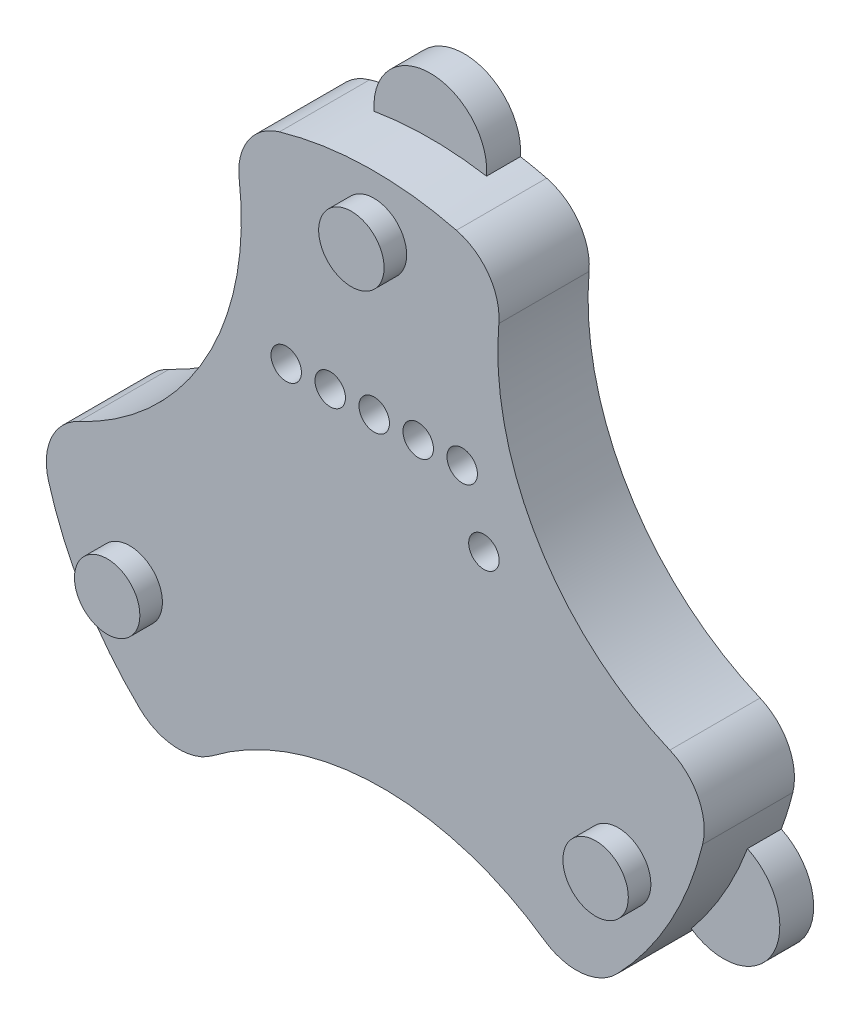
ISO-10303-21;
HEADER;
FILE_DESCRIPTION(('STEP AP214'),'2;1');
FILE_NAME('part.step','',(''),(''),'','','');
FILE_SCHEMA(('AUTOMOTIVE_DESIGN { 1 0 10303 214 1 1 1 1 }'));
ENDSEC;
DATA;
#1=APPLICATION_CONTEXT('core data for automotive mechanical design processes');
#2=APPLICATION_PROTOCOL_DEFINITION('international standard','automotive_design',2000,#1);
#3=PRODUCT_CONTEXT('',#1,'mechanical');
#4=PRODUCT('Part','Part','',(#3));
#5=PRODUCT_RELATED_PRODUCT_CATEGORY('part','',(#4));
#6=PRODUCT_DEFINITION_FORMATION('','',#4);
#7=PRODUCT_DEFINITION_CONTEXT('part definition',#1,'design');
#8=PRODUCT_DEFINITION('design','',#6,#7);
#9=PRODUCT_DEFINITION_SHAPE('','',#8);
#10=(LENGTH_UNIT() NAMED_UNIT(*) SI_UNIT(.MILLI.,.METRE.));
#11=(NAMED_UNIT(*) PLANE_ANGLE_UNIT() SI_UNIT($,.RADIAN.));
#12=(NAMED_UNIT(*) SI_UNIT($,.STERADIAN.) SOLID_ANGLE_UNIT());
#13=UNCERTAINTY_MEASURE_WITH_UNIT(LENGTH_MEASURE(1.E-05),#10,'distance_accuracy_value','');
#14=(GEOMETRIC_REPRESENTATION_CONTEXT(3) GLOBAL_UNCERTAINTY_ASSIGNED_CONTEXT((#13)) GLOBAL_UNIT_ASSIGNED_CONTEXT((#10,
#11,#12)) REPRESENTATION_CONTEXT('',''));
#15=CARTESIAN_POINT('',(0.,0.,0.));
#16=DIRECTION('',(0.,0.,1.));
#17=DIRECTION('',(1.,0.,0.));
#18=AXIS2_PLACEMENT_3D('',#15,#16,#17);
#19=CARTESIAN_POINT('',(0.,0.,-74.8528137423857));
#20=DIRECTION('',(0.,0.,1.));
#21=DIRECTION('',(1.,0.,0.));
#22=AXIS2_PLACEMENT_3D('',#19,#20,#21);
#23=CYLINDRICAL_SURFACE('',#22,30.);
#24=CARTESIAN_POINT('',(0.,0.,18.));
#25=DIRECTION('',(0.,0.,1.));
#26=DIRECTION('',(1.,0.,0.));
#27=AXIS2_PLACEMENT_3D('',#24,#25,#26);
#28=CIRCLE('',#27,30.);
#29=CARTESIAN_POINT('',(21.5430409730913,-20.8781557047481,18.));
#30=VERTEX_POINT('',#29);
#31=CARTESIAN_POINT('',(29.1356396654635,-7.14944062736878,18.));
#32=VERTEX_POINT('',#31);
#33=EDGE_CURVE('E308',#30,#32,#28,.T.);
#34=ORIENTED_EDGE('',*,*,#33,.F.);
#35=DIRECTION('',(0.,0.,1.));
#36=VECTOR('',#35,1.);
#37=CARTESIAN_POINT('',(21.5430409730913,-20.8781557047482,-74.8528137423857));
#38=LINE('',#37,#36);
#39=CARTESIAN_POINT('',(21.5430409730913,-20.8781557047481,9.99999999999999));
#40=VERTEX_POINT('',#39);
#41=EDGE_CURVE('E238',#30,#40,#38,.F.);
#42=ORIENTED_EDGE('',*,*,#41,.T.);
#43=CARTESIAN_POINT('',(0.,0.,9.99999999999999));
#44=DIRECTION('',(0.,0.,1.));
#45=DIRECTION('',(1.,0.,0.));
#46=AXIS2_PLACEMENT_3D('',#43,#44,#45);
#47=CIRCLE('',#46,30.);
#48=CARTESIAN_POINT('',(23.1286138738096,-19.1067323285857,9.99999999999999));
#49=VERTEX_POINT('',#48);
#50=EDGE_CURVE('E174',#49,#40,#47,.F.);
#51=ORIENTED_EDGE('',*,*,#50,.F.);
#52=DIRECTION('',(0.,0.,-1.));
#53=VECTOR('',#52,1.);
#54=CARTESIAN_POINT('',(23.1286138738096,-19.1067323285857,11.5));
#55=LINE('',#54,#53);
#56=CARTESIAN_POINT('',(23.1286138738096,-19.1067323285857,13.));
#57=VERTEX_POINT('',#56);
#58=EDGE_CURVE('E183',#57,#49,#55,.T.);
#59=ORIENTED_EDGE('',*,*,#58,.F.);
#60=CARTESIAN_POINT('',(0.,0.,13.));
#61=DIRECTION('',(0.,0.,-1.));
#62=DIRECTION('',(-1.,0.,0.));
#63=AXIS2_PLACEMENT_3D('',#60,#61,#62);
#64=CIRCLE('',#63,30.);
#65=CARTESIAN_POINT('',(28.1112225167689,-10.4766010047489,13.));
#66=VERTEX_POINT('',#65);
#67=EDGE_CURVE('E190',#57,#66,#64,.F.);
#68=ORIENTED_EDGE('',*,*,#67,.T.);
#69=DIRECTION('',(0.,0.,-1.));
#70=VECTOR('',#69,1.);
#71=CARTESIAN_POINT('',(28.1112225167689,-10.4766010047489,11.5));
#72=LINE('',#71,#70);
#73=CARTESIAN_POINT('',(28.1112225167689,-10.4766010047489,10.));
#74=VERTEX_POINT('',#73);
#75=EDGE_CURVE('E180',#74,#66,#72,.F.);
#76=ORIENTED_EDGE('',*,*,#75,.F.);
#77=CARTESIAN_POINT('',(29.1356396654635,-7.14944062736878,9.99999999999999));
#78=VERTEX_POINT('',#77);
#79=EDGE_CURVE('E160',#78,#74,#47,.F.);
#80=ORIENTED_EDGE('',*,*,#79,.F.);
#81=DIRECTION('',(0.,0.,1.));
#82=VECTOR('',#81,1.);
#83=CARTESIAN_POINT('',(29.1356396654635,-7.14944062736878,-74.8528137423857));
#84=LINE('',#83,#82);
#85=EDGE_CURVE('E236',#78,#32,#84,.T.);
#86=ORIENTED_EDGE('',*,*,#85,.T.);
#87=EDGE_LOOP('',(#34,#42,#51,#59,#68,#76,#80,#86));
#88=FACE_BOUND('',#87,.T.);
#89=ADVANCED_FACE('F35',(#88),#23,.T.);
#90=CARTESIAN_POINT('',(-28.8525337110247,-8.21774290509159,18.));
#91=VERTEX_POINT('',#90);
#92=CARTESIAN_POINT('',(-20.7594170388841,-21.6574837921142,18.));
#93=VERTEX_POINT('',#92);
#94=EDGE_CURVE('E314',#91,#93,#28,.T.);
#95=ORIENTED_EDGE('',*,*,#94,.F.);
#96=DIRECTION('',(0.,0.,1.));
#97=VECTOR('',#96,1.);
#98=CARTESIAN_POINT('',(-28.8525337110247,-8.21774290509159,-74.8528137423857));
#99=LINE('',#98,#97);
#100=CARTESIAN_POINT('',(-28.8525337110247,-8.21774290509159,9.99999999999999));
#101=VERTEX_POINT('',#100);
#102=EDGE_CURVE('E228',#91,#101,#99,.F.);
#103=ORIENTED_EDGE('',*,*,#102,.T.);
#104=CARTESIAN_POINT('',(-28.1112225167699,-10.4766010047463,9.99999999999999));
#105=VERTEX_POINT('',#104);
#106=EDGE_CURVE('E313',#105,#101,#47,.F.);
#107=ORIENTED_EDGE('',*,*,#106,.F.);
#108=DIRECTION('',(0.,0.,-1.));
#109=VECTOR('',#108,1.);
#110=CARTESIAN_POINT('',(-28.1112225167699,-10.4766010047463,11.5));
#111=LINE('',#110,#109);
#112=CARTESIAN_POINT('',(-28.1112225167699,-10.4766010047463,13.));
#113=VERTEX_POINT('',#112);
#114=EDGE_CURVE('E363',#113,#105,#111,.T.);
#115=ORIENTED_EDGE('',*,*,#114,.F.);
#116=CARTESIAN_POINT('',(0.,0.,13.));
#117=DIRECTION('',(0.,0.,-1.));
#118=DIRECTION('',(-1.,0.,0.));
#119=AXIS2_PLACEMENT_3D('',#116,#117,#118);
#120=CIRCLE('',#119,30.);
#121=CARTESIAN_POINT('',(-23.1286138738115,-19.1067323285833,13.));
#122=VERTEX_POINT('',#121);
#123=EDGE_CURVE('E360',#113,#122,#120,.F.);
#124=ORIENTED_EDGE('',*,*,#123,.T.);
#125=DIRECTION('',(0.,0.,-1.));
#126=VECTOR('',#125,1.);
#127=CARTESIAN_POINT('',(-23.1286138738115,-19.1067323285833,11.5));
#128=LINE('',#127,#126);
#129=CARTESIAN_POINT('',(-23.1286138738115,-19.1067323285833,10.));
#130=VERTEX_POINT('',#129);
#131=EDGE_CURVE('E366',#130,#122,#128,.F.);
#132=ORIENTED_EDGE('',*,*,#131,.F.);
#133=CARTESIAN_POINT('',(-20.7594170388841,-21.6574837921142,9.99999999999999));
#134=VERTEX_POINT('',#133);
#135=EDGE_CURVE('E380',#134,#130,#47,.F.);
#136=ORIENTED_EDGE('',*,*,#135,.F.);
#137=DIRECTION('',(0.,0.,1.));
#138=VECTOR('',#137,1.);
#139=CARTESIAN_POINT('',(-20.7594170388841,-21.6574837921142,-74.8528137423857));
#140=LINE('',#139,#138);
#141=EDGE_CURVE('E50',#134,#93,#140,.T.);
#142=ORIENTED_EDGE('',*,*,#141,.T.);
#143=EDGE_LOOP('',(#95,#103,#107,#115,#124,#132,#136,#142));
#144=FACE_BOUND('',#143,.T.);
#145=ADVANCED_FACE('F375',(#144),#23,.T.);
#146=CARTESIAN_POINT('',(0.,0.,18.));
#147=DIRECTION('',(0.,0.,1.));
#148=DIRECTION('',(1.,0.,0.));
#149=AXIS2_PLACEMENT_3D('',#146,#147,#148);
#150=PLANE('',#149);
#151=CARTESIAN_POINT('',(7.30949273793404,29.09589860984,18.));
#152=VERTEX_POINT('',#151);
#153=CARTESIAN_POINT('',(-8.37622262657907,28.8069244194861,18.));
#154=VERTEX_POINT('',#153);
#155=EDGE_CURVE('E316',#152,#154,#28,.T.);
#156=ORIENTED_EDGE('',*,*,#155,.T.);
#157=CARTESIAN_POINT('',(-6.98018552214922,24.0057703495718,18.));
#158=DIRECTION('',(0.,0.,1.));
#159=DIRECTION('',(1.,0.,0.));
#160=AXIS2_PLACEMENT_3D('',#157,#158,#159);
#161=CIRCLE('',#160,5.);
#162=CARTESIAN_POINT('',(-11.9424393360958,23.3925517213705,18.));
#163=VERTEX_POINT('',#162);
#164=EDGE_CURVE('E225',#154,#163,#161,.T.);
#165=ORIENTED_EDGE('',*,*,#164,.T.);
#166=CARTESIAN_POINT('',(-36.7537084058306,20.3264585803642,18.));
#167=DIRECTION('',(0.,0.,-1.));
#168=DIRECTION('',(-1.,0.,0.));
#169=AXIS2_PLACEMENT_3D('',#166,#167,#168);
#170=CIRCLE('',#169,25.0000000000022);
#171=CARTESIAN_POINT('',(-26.1620998114054,-2.31902280958655,18.));
#172=VERTEX_POINT('',#171);
#173=EDGE_CURVE('E262',#163,#172,#170,.T.);
#174=ORIENTED_EDGE('',*,*,#173,.T.);
#175=CARTESIAN_POINT('',(-24.0437780925206,-6.84811908757632,18.));
#176=DIRECTION('',(0.,0.,1.));
#177=DIRECTION('',(1.,0.,0.));
#178=AXIS2_PLACEMENT_3D('',#175,#176,#177);
#179=CIRCLE('',#178,5.);
#180=EDGE_CURVE('E57',#172,#91,#179,.T.);
#181=ORIENTED_EDGE('',*,*,#180,.T.);
#182=ORIENTED_EDGE('',*,*,#94,.T.);
#183=CARTESIAN_POINT('',(-17.2995141990701,-18.0479031600951,18.));
#184=DIRECTION('',(0.,0.,1.));
#185=DIRECTION('',(1.,0.,0.));
#186=AXIS2_PLACEMENT_3D('',#183,#184,#185);
#187=CIRCLE('',#186,5.);
#188=CARTESIAN_POINT('',(-14.2873243820006,-22.0387317088983,18.));
#189=VERTEX_POINT('',#188);
#190=EDGE_CURVE('E222',#93,#189,#187,.T.);
#191=ORIENTED_EDGE('',*,*,#190,.T.);
#192=CARTESIAN_POINT('',(0.773624703347678,-41.9928744529151,18.));
#193=DIRECTION('',(0.,0.,-1.));
#194=DIRECTION('',(-1.,0.,0.));
#195=AXIS2_PLACEMENT_3D('',#192,#193,#194);
#196=CIRCLE('',#195,25.0000000000009);
#197=CARTESIAN_POINT('',(15.0893825707604,-21.4975316482275,18.));
#198=VERTEX_POINT('',#197);
#199=EDGE_CURVE('E392',#189,#198,#196,.T.);
#200=ORIENTED_EDGE('',*,*,#199,.T.);
#201=CARTESIAN_POINT('',(17.9525341442428,-17.3984630872901,18.));
#202=DIRECTION('',(0.,0.,1.));
#203=DIRECTION('',(1.,0.,0.));
#204=AXIS2_PLACEMENT_3D('',#201,#202,#203);
#205=CIRCLE('',#204,5.);
#206=EDGE_CURVE('E220',#198,#30,#205,.T.);
#207=ORIENTED_EDGE('',*,*,#206,.T.);
#208=ORIENTED_EDGE('',*,*,#33,.T.);
#209=CARTESIAN_POINT('',(24.2796997212196,-5.95786718947399,18.));
#210=DIRECTION('',(0.,0.,1.));
#211=DIRECTION('',(1.,0.,0.));
#212=AXIS2_PLACEMENT_3D('',#209,#210,#211);
#213=CIRCLE('',#212,5.);
#214=CARTESIAN_POINT('',(26.2297637180965,-1.35382001246934,18.));
#215=VERTEX_POINT('',#214);
#216=EDGE_CURVE('E218',#32,#215,#213,.T.);
#217=ORIENTED_EDGE('',*,*,#216,.T.);
#218=CARTESIAN_POINT('',(35.9800837024811,21.6664158725539,18.));
#219=DIRECTION('',(0.,0.,-1.));
#220=DIRECTION('',(-1.,0.,0.));
#221=AXIS2_PLACEMENT_3D('',#218,#219,#220);
#222=CIRCLE('',#221,25.);
#223=CARTESIAN_POINT('',(11.0727172406455,23.8165544578145,18.));
#224=VERTEX_POINT('',#223);
#225=EDGE_CURVE('E246',#215,#224,#222,.T.);
#226=ORIENTED_EDGE('',*,*,#225,.T.);
#227=CARTESIAN_POINT('',(6.09124394827837,24.2465821748667,18.));
#228=DIRECTION('',(0.,0.,1.));
#229=DIRECTION('',(1.,0.,0.));
#230=AXIS2_PLACEMENT_3D('',#227,#228,#229);
#231=CIRCLE('',#230,5.);
#232=EDGE_CURVE('E216',#224,#152,#231,.T.);
#233=ORIENTED_EDGE('',*,*,#232,.T.);
#234=EDGE_LOOP('',(#156,#165,#174,#181,#182,#191,#200,#207,#208,#217,#226,#233));
#235=FACE_BOUND('',#234,.T.);
#236=CARTESIAN_POINT('',(-21.6506350946094,-12.5000000000009,18.));
#237=DIRECTION('',(0.,0.,1.));
#238=DIRECTION('',(1.,0.,0.));
#239=AXIS2_PLACEMENT_3D('',#236,#237,#238);
#240=CIRCLE('',#239,2.9);
#241=CARTESIAN_POINT('',(-18.7506350946094,-12.5000000000009,18.));
#242=VERTEX_POINT('',#241);
#243=EDGE_CURVE('E291',#242,#242,#240,.T.);
#244=ORIENTED_EDGE('',*,*,#243,.F.);
#245=EDGE_LOOP('',(#244));
#246=FACE_BOUND('',#245,.T.);
#247=CARTESIAN_POINT('',(21.6506350946126,-12.4999999999991,18.));
#248=DIRECTION('',(0.,0.,1.));
#249=DIRECTION('',(1.,0.,0.));
#250=AXIS2_PLACEMENT_3D('',#247,#248,#249);
#251=CIRCLE('',#250,2.9);
#252=CARTESIAN_POINT('',(24.5506350946126,-12.4999999999991,18.));
#253=VERTEX_POINT('',#252);
#254=EDGE_CURVE('E296',#253,#253,#251,.T.);
#255=ORIENTED_EDGE('',*,*,#254,.F.);
#256=EDGE_LOOP('',(#255));
#257=FACE_BOUND('',#256,.T.);
#258=CARTESIAN_POINT('',(0.,25.,18.));
#259=DIRECTION('',(0.,0.,1.));
#260=DIRECTION('',(1.,0.,0.));
#261=AXIS2_PLACEMENT_3D('',#258,#259,#260);
#262=CIRCLE('',#261,2.9);
#263=CARTESIAN_POINT('',(2.9,25.,18.));
#264=VERTEX_POINT('',#263);
#265=EDGE_CURVE('E302',#264,#264,#262,.T.);
#266=ORIENTED_EDGE('',*,*,#265,.F.);
#267=EDGE_LOOP('',(#266));
#268=FACE_BOUND('',#267,.T.);
#269=CARTESIAN_POINT('',(-7.77573119423447,11.3014524712798,18.));
#270=DIRECTION('',(0.,0.,1.));
#271=DIRECTION('',(1.,0.,0.));
#272=AXIS2_PLACEMENT_3D('',#269,#270,#271);
#273=CIRCLE('',#272,1.35006984065214);
#274=CARTESIAN_POINT('',(-6.42566135358233,11.3014524712798,18.));
#275=VERTEX_POINT('',#274);
#276=EDGE_CURVE('E317',#275,#275,#273,.T.);
#277=ORIENTED_EDGE('',*,*,#276,.F.);
#278=EDGE_LOOP('',(#277));
#279=FACE_BOUND('',#278,.T.);
#280=CARTESIAN_POINT('',(0.0242688057655299,11.3014524712799,18.));
#281=DIRECTION('',(0.,0.,1.));
#282=DIRECTION('',(1.,0.,0.));
#283=AXIS2_PLACEMENT_3D('',#280,#281,#282);
#284=CIRCLE('',#283,1.35006984065214);
#285=CARTESIAN_POINT('',(1.37433864641767,11.3014524712799,18.));
#286=VERTEX_POINT('',#285);
#287=EDGE_CURVE('E329',#286,#286,#284,.T.);
#288=ORIENTED_EDGE('',*,*,#287,.F.);
#289=EDGE_LOOP('',(#288));
#290=FACE_BOUND('',#289,.T.);
#291=CARTESIAN_POINT('',(9.74910005595495,5.62968470753552,18.));
#292=DIRECTION('',(0.,0.,1.));
#293=DIRECTION('',(1.,0.,0.));
#294=AXIS2_PLACEMENT_3D('',#291,#292,#293);
#295=CIRCLE('',#294,1.35006984065214);
#296=CARTESIAN_POINT('',(11.0991698966071,5.62968470753552,18.));
#297=VERTEX_POINT('',#296);
#298=EDGE_CURVE('E341',#297,#297,#295,.T.);
#299=ORIENTED_EDGE('',*,*,#298,.F.);
#300=EDGE_LOOP('',(#299));
#301=FACE_BOUND('',#300,.T.);
#302=CARTESIAN_POINT('',(7.82426880576553,11.3014524712799,18.));
#303=DIRECTION('',(0.,0.,1.));
#304=DIRECTION('',(1.,0.,0.));
#305=AXIS2_PLACEMENT_3D('',#302,#303,#304);
#306=CIRCLE('',#305,1.35006984065214);
#307=CARTESIAN_POINT('',(9.17433864641766,11.3014524712799,18.));
#308=VERTEX_POINT('',#307);
#309=EDGE_CURVE('E347',#308,#308,#306,.T.);
#310=ORIENTED_EDGE('',*,*,#309,.F.);
#311=EDGE_LOOP('',(#310));
#312=FACE_BOUND('',#311,.T.);
#313=CARTESIAN_POINT('',(3.92426880576553,11.3014524712799,18.));
#314=DIRECTION('',(0.,0.,1.));
#315=DIRECTION('',(1.,0.,0.));
#316=AXIS2_PLACEMENT_3D('',#313,#314,#315);
#317=CIRCLE('',#316,1.35006984065214);
#318=CARTESIAN_POINT('',(5.27433864641767,11.3014524712799,18.));
#319=VERTEX_POINT('',#318);
#320=EDGE_CURVE('E335',#319,#319,#317,.T.);
#321=ORIENTED_EDGE('',*,*,#320,.F.);
#322=EDGE_LOOP('',(#321));
#323=FACE_BOUND('',#322,.T.);
#324=CARTESIAN_POINT('',(-3.87573119423447,11.3014524712799,18.));
#325=DIRECTION('',(0.,0.,1.));
#326=DIRECTION('',(1.,0.,0.));
#327=AXIS2_PLACEMENT_3D('',#324,#325,#326);
#328=CIRCLE('',#327,1.35006984065214);
#329=CARTESIAN_POINT('',(-2.52566135358233,11.3014524712799,18.));
#330=VERTEX_POINT('',#329);
#331=EDGE_CURVE('E323',#330,#330,#328,.T.);
#332=ORIENTED_EDGE('',*,*,#331,.F.);
#333=EDGE_LOOP('',(#332));
#334=FACE_BOUND('',#333,.T.);
#335=ADVANCED_FACE('F252',(#235,#246,#257,#268,#279,#290,#301,#312,#323,#334),#150,.T.);
#336=CARTESIAN_POINT('',(0.,0.,10.));
#337=DIRECTION('',(0.,0.,1.));
#338=DIRECTION('',(1.,0.,0.));
#339=AXIS2_PLACEMENT_3D('',#336,#337,#338);
#340=PLANE('',#339);
#341=CARTESIAN_POINT('',(0.,25.,10.));
#342=DIRECTION('',(0.,0.,-1.));
#343=DIRECTION('',(-1.,0.,0.));
#344=AXIS2_PLACEMENT_3D('',#341,#342,#343);
#345=CIRCLE('',#344,3.);
#346=CARTESIAN_POINT('',(-3.,25.,10.));
#347=VERTEX_POINT('',#346);
#348=EDGE_CURVE('E270',#347,#347,#345,.T.);
#349=ORIENTED_EDGE('',*,*,#348,.F.);
#350=EDGE_LOOP('',(#349));
#351=FACE_BOUND('',#350,.T.);
#352=CARTESIAN_POINT('',(-21.6506350946094,-12.5000000000009,10.));
#353=DIRECTION('',(0.,0.,-1.));
#354=DIRECTION('',(-1.,0.,0.));
#355=AXIS2_PLACEMENT_3D('',#352,#353,#354);
#356=CIRCLE('',#355,3.);
#357=CARTESIAN_POINT('',(-24.6506350946094,-12.5000000000009,10.));
#358=VERTEX_POINT('',#357);
#359=EDGE_CURVE('E276',#358,#358,#356,.T.);
#360=ORIENTED_EDGE('',*,*,#359,.F.);
#361=EDGE_LOOP('',(#360));
#362=FACE_BOUND('',#361,.T.);
#363=CARTESIAN_POINT('',(21.6506350946126,-12.4999999999991,10.));
#364=DIRECTION('',(0.,0.,-1.));
#365=DIRECTION('',(-1.,0.,0.));
#366=AXIS2_PLACEMENT_3D('',#363,#364,#365);
#367=CIRCLE('',#366,3.);
#368=CARTESIAN_POINT('',(18.6506350946126,-12.4999999999991,10.));
#369=VERTEX_POINT('',#368);
#370=EDGE_CURVE('E257',#369,#369,#367,.T.);
#371=ORIENTED_EDGE('',*,*,#370,.F.);
#372=EDGE_LOOP('',(#371));
#373=FACE_BOUND('',#372,.T.);
#374=CARTESIAN_POINT('',(-36.7537084058306,20.3264585803642,10.));
#375=DIRECTION('',(0.,0.,-1.));
#376=DIRECTION('',(-1.,0.,0.));
#377=AXIS2_PLACEMENT_3D('',#374,#375,#376);
#378=CIRCLE('',#377,25.0000000000022);
#379=CARTESIAN_POINT('',(-11.9424393360958,23.3925517213705,10.));
#380=VERTEX_POINT('',#379);
#381=CARTESIAN_POINT('',(-26.1620998114054,-2.31902280958655,10.));
#382=VERTEX_POINT('',#381);
#383=EDGE_CURVE('E395',#380,#382,#378,.T.);
#384=ORIENTED_EDGE('',*,*,#383,.F.);
#385=CARTESIAN_POINT('',(-6.98018552214922,24.0057703495718,9.99999999999999));
#386=DIRECTION('',(0.,0.,1.));
#387=DIRECTION('',(1.,0.,0.));
#388=AXIS2_PLACEMENT_3D('',#385,#386,#387);
#389=CIRCLE('',#388,5.);
#390=CARTESIAN_POINT('',(-8.37622262657907,28.8069244194861,9.99999999999999));
#391=VERTEX_POINT('',#390);
#392=EDGE_CURVE('E210',#380,#391,#389,.F.);
#393=ORIENTED_EDGE('',*,*,#392,.T.);
#394=CARTESIAN_POINT('',(-4.98260864295892,29.5833333333333,10.));
#395=VERTEX_POINT('',#394);
#396=EDGE_CURVE('E176',#391,#395,#47,.F.);
#397=ORIENTED_EDGE('',*,*,#396,.T.);
#398=CARTESIAN_POINT('',(0.,30.,10.));
#399=DIRECTION('',(0.,0.,-1.));
#400=DIRECTION('',(-1.,0.,0.));
#401=AXIS2_PLACEMENT_3D('',#398,#399,#400);
#402=CIRCLE('',#401,5.);
#403=CARTESIAN_POINT('',(4.98260864295892,29.5833333333333,9.99999999999999));
#404=VERTEX_POINT('',#403);
#405=EDGE_CURVE('E286',#395,#404,#402,.T.);
#406=ORIENTED_EDGE('',*,*,#405,.T.);
#407=CARTESIAN_POINT('',(7.30949273793404,29.09589860984,9.99999999999999));
#408=VERTEX_POINT('',#407);
#409=EDGE_CURVE('E173',#404,#408,#47,.F.);
#410=ORIENTED_EDGE('',*,*,#409,.T.);
#411=CARTESIAN_POINT('',(6.09124394827837,24.2465821748667,9.99999999999999));
#412=DIRECTION('',(0.,0.,1.));
#413=DIRECTION('',(1.,0.,0.));
#414=AXIS2_PLACEMENT_3D('',#411,#412,#413);
#415=CIRCLE('',#414,5.);
#416=CARTESIAN_POINT('',(11.0727172406455,23.8165544578145,10.));
#417=VERTEX_POINT('',#416);
#418=EDGE_CURVE('E201',#408,#417,#415,.F.);
#419=ORIENTED_EDGE('',*,*,#418,.T.);
#420=CARTESIAN_POINT('',(35.9800837024811,21.6664158725539,10.));
#421=DIRECTION('',(0.,0.,-1.));
#422=DIRECTION('',(-1.,0.,0.));
#423=AXIS2_PLACEMENT_3D('',#420,#421,#422);
#424=CIRCLE('',#423,25.);
#425=CARTESIAN_POINT('',(26.2297637180965,-1.35382001246934,10.));
#426=VERTEX_POINT('',#425);
#427=EDGE_CURVE('E248',#426,#417,#424,.T.);
#428=ORIENTED_EDGE('',*,*,#427,.F.);
#429=CARTESIAN_POINT('',(24.2796997212196,-5.95786718947399,9.99999999999999));
#430=DIRECTION('',(0.,0.,1.));
#431=DIRECTION('',(1.,0.,0.));
#432=AXIS2_PLACEMENT_3D('',#429,#430,#431);
#433=CIRCLE('',#432,5.);
#434=EDGE_CURVE('E169',#426,#78,#433,.F.);
#435=ORIENTED_EDGE('',*,*,#434,.T.);
#436=ORIENTED_EDGE('',*,*,#79,.T.);
#437=CARTESIAN_POINT('',(25.980762113531,-14.9999999999996,10.));
#438=DIRECTION('',(0.,0.,-1.));
#439=DIRECTION('',(-1.,0.,0.));
#440=AXIS2_PLACEMENT_3D('',#437,#438,#439);
#441=CIRCLE('',#440,5.);
#442=EDGE_CURVE('E166',#74,#49,#441,.T.);
#443=ORIENTED_EDGE('',*,*,#442,.T.);
#444=ORIENTED_EDGE('',*,*,#50,.T.);
#445=CARTESIAN_POINT('',(17.9525341442428,-17.3984630872901,9.99999999999999));
#446=DIRECTION('',(0.,0.,1.));
#447=DIRECTION('',(1.,0.,0.));
#448=AXIS2_PLACEMENT_3D('',#445,#446,#447);
#449=CIRCLE('',#448,5.);
#450=CARTESIAN_POINT('',(15.0893825707604,-21.4975316482275,10.));
#451=VERTEX_POINT('',#450);
#452=EDGE_CURVE('E204',#40,#451,#449,.F.);
#453=ORIENTED_EDGE('',*,*,#452,.T.);
#454=CARTESIAN_POINT('',(0.773624703347678,-41.9928744529151,10.));
#455=DIRECTION('',(0.,0.,-1.));
#456=DIRECTION('',(-1.,0.,0.));
#457=AXIS2_PLACEMENT_3D('',#454,#455,#456);
#458=CIRCLE('',#457,25.0000000000009);
#459=CARTESIAN_POINT('',(-14.2873243820006,-22.0387317088983,10.));
#460=VERTEX_POINT('',#459);
#461=EDGE_CURVE('E265',#460,#451,#458,.T.);
#462=ORIENTED_EDGE('',*,*,#461,.F.);
#463=CARTESIAN_POINT('',(-17.2995141990701,-18.0479031600951,9.99999999999999));
#464=DIRECTION('',(0.,0.,1.));
#465=DIRECTION('',(1.,0.,0.));
#466=AXIS2_PLACEMENT_3D('',#463,#464,#465);
#467=CIRCLE('',#466,5.);
#468=EDGE_CURVE('E206',#460,#134,#467,.F.);
#469=ORIENTED_EDGE('',*,*,#468,.T.);
#470=ORIENTED_EDGE('',*,*,#135,.T.);
#471=CARTESIAN_POINT('',(-25.9807621135339,-14.9999999999979,10.));
#472=DIRECTION('',(0.,0.,-1.));
#473=DIRECTION('',(-1.,0.,0.));
#474=AXIS2_PLACEMENT_3D('',#471,#472,#473);
#475=CIRCLE('',#474,5.);
#476=EDGE_CURVE('E281',#130,#105,#475,.T.);
#477=ORIENTED_EDGE('',*,*,#476,.T.);
#478=ORIENTED_EDGE('',*,*,#106,.T.);
#479=CARTESIAN_POINT('',(-24.0437780925206,-6.84811908757632,9.99999999999999));
#480=DIRECTION('',(0.,0.,1.));
#481=DIRECTION('',(1.,0.,0.));
#482=AXIS2_PLACEMENT_3D('',#479,#480,#481);
#483=CIRCLE('',#482,5.);
#484=EDGE_CURVE('E208',#101,#382,#483,.F.);
#485=ORIENTED_EDGE('',*,*,#484,.T.);
#486=EDGE_LOOP('',(#384,#393,#397,#406,#410,#419,#428,#435,#436,#443,#444,#453,#462,#469,#470,
#477,#478,#485));
#487=FACE_BOUND('',#486,.T.);
#488=CARTESIAN_POINT('',(-7.77573119423447,11.3014524712798,10.));
#489=DIRECTION('',(0.,0.,1.));
#490=DIRECTION('',(1.,0.,0.));
#491=AXIS2_PLACEMENT_3D('',#488,#489,#490);
#492=CIRCLE('',#491,1.35006984065214);
#493=CARTESIAN_POINT('',(-6.42566135358233,11.3014524712798,10.));
#494=VERTEX_POINT('',#493);
#495=EDGE_CURVE('E312',#494,#494,#492,.T.);
#496=ORIENTED_EDGE('',*,*,#495,.T.);
#497=EDGE_LOOP('',(#496));
#498=FACE_BOUND('',#497,.T.);
#499=CARTESIAN_POINT('',(-3.87573119423447,11.3014524712799,10.));
#500=DIRECTION('',(0.,0.,1.));
#501=DIRECTION('',(1.,0.,0.));
#502=AXIS2_PLACEMENT_3D('',#499,#500,#501);
#503=CIRCLE('',#502,1.35006984065214);
#504=CARTESIAN_POINT('',(-2.52566135358233,11.3014524712799,10.));
#505=VERTEX_POINT('',#504);
#506=EDGE_CURVE('E320',#505,#505,#503,.T.);
#507=ORIENTED_EDGE('',*,*,#506,.T.);
#508=EDGE_LOOP('',(#507));
#509=FACE_BOUND('',#508,.T.);
#510=CARTESIAN_POINT('',(0.0242688057655299,11.3014524712799,10.));
#511=DIRECTION('',(0.,0.,1.));
#512=DIRECTION('',(1.,0.,0.));
#513=AXIS2_PLACEMENT_3D('',#510,#511,#512);
#514=CIRCLE('',#513,1.35006984065214);
#515=CARTESIAN_POINT('',(1.37433864641767,11.3014524712799,10.));
#516=VERTEX_POINT('',#515);
#517=EDGE_CURVE('E326',#516,#516,#514,.T.);
#518=ORIENTED_EDGE('',*,*,#517,.T.);
#519=EDGE_LOOP('',(#518));
#520=FACE_BOUND('',#519,.T.);
#521=CARTESIAN_POINT('',(3.92426880576553,11.3014524712799,10.));
#522=DIRECTION('',(0.,0.,1.));
#523=DIRECTION('',(1.,0.,0.));
#524=AXIS2_PLACEMENT_3D('',#521,#522,#523);
#525=CIRCLE('',#524,1.35006984065214);
#526=CARTESIAN_POINT('',(5.27433864641767,11.3014524712799,10.));
#527=VERTEX_POINT('',#526);
#528=EDGE_CURVE('E332',#527,#527,#525,.T.);
#529=ORIENTED_EDGE('',*,*,#528,.T.);
#530=EDGE_LOOP('',(#529));
#531=FACE_BOUND('',#530,.T.);
#532=CARTESIAN_POINT('',(9.74910005595495,5.62968470753552,10.));
#533=DIRECTION('',(0.,0.,1.));
#534=DIRECTION('',(1.,0.,0.));
#535=AXIS2_PLACEMENT_3D('',#532,#533,#534);
#536=CIRCLE('',#535,1.35006984065214);
#537=CARTESIAN_POINT('',(11.0991698966071,5.62968470753552,10.));
#538=VERTEX_POINT('',#537);
#539=EDGE_CURVE('E338',#538,#538,#536,.T.);
#540=ORIENTED_EDGE('',*,*,#539,.T.);
#541=EDGE_LOOP('',(#540));
#542=FACE_BOUND('',#541,.T.);
#543=CARTESIAN_POINT('',(7.82426880576553,11.3014524712799,10.));
#544=DIRECTION('',(0.,0.,1.));
#545=DIRECTION('',(1.,0.,0.));
#546=AXIS2_PLACEMENT_3D('',#543,#544,#545);
#547=CIRCLE('',#546,1.35006984065214);
#548=CARTESIAN_POINT('',(9.17433864641766,11.3014524712799,10.));
#549=VERTEX_POINT('',#548);
#550=EDGE_CURVE('E344',#549,#549,#547,.T.);
#551=ORIENTED_EDGE('',*,*,#550,.T.);
#552=EDGE_LOOP('',(#551));
#553=FACE_BOUND('',#552,.T.);
#554=ADVANCED_FACE('F163',(#351,#362,#373,#487,#498,#509,#520,#531,#542,#553),#340,.F.);
#555=CARTESIAN_POINT('',(7.82426880576553,11.3014524712799,18.));
#556=DIRECTION('',(0.,0.,-1.));
#557=DIRECTION('',(-1.,0.,0.));
#558=AXIS2_PLACEMENT_3D('',#555,#556,#557);
#559=CYLINDRICAL_SURFACE('',#558,1.35006984065214);
#560=ORIENTED_EDGE('',*,*,#309,.T.);
#561=EDGE_LOOP('',(#560));
#562=FACE_BOUND('',#561,.T.);
#563=ORIENTED_EDGE('',*,*,#550,.F.);
#564=EDGE_LOOP('',(#563));
#565=FACE_BOUND('',#564,.T.);
#566=ADVANCED_FACE('F464',(#562,#565),#559,.F.);
#567=CARTESIAN_POINT('',(9.74910005595495,5.62968470753552,18.));
#568=DIRECTION('',(0.,0.,-1.));
#569=DIRECTION('',(-1.,0.,0.));
#570=AXIS2_PLACEMENT_3D('',#567,#568,#569);
#571=CYLINDRICAL_SURFACE('',#570,1.35006984065214);
#572=ORIENTED_EDGE('',*,*,#298,.T.);
#573=EDGE_LOOP('',(#572));
#574=FACE_BOUND('',#573,.T.);
#575=ORIENTED_EDGE('',*,*,#539,.F.);
#576=EDGE_LOOP('',(#575));
#577=FACE_BOUND('',#576,.T.);
#578=ADVANCED_FACE('F460',(#574,#577),#571,.F.);
#579=CARTESIAN_POINT('',(3.92426880576553,11.3014524712799,18.));
#580=DIRECTION('',(0.,0.,-1.));
#581=DIRECTION('',(-1.,0.,0.));
#582=AXIS2_PLACEMENT_3D('',#579,#580,#581);
#583=CYLINDRICAL_SURFACE('',#582,1.35006984065214);
#584=ORIENTED_EDGE('',*,*,#320,.T.);
#585=EDGE_LOOP('',(#584));
#586=FACE_BOUND('',#585,.T.);
#587=ORIENTED_EDGE('',*,*,#528,.F.);
#588=EDGE_LOOP('',(#587));
#589=FACE_BOUND('',#588,.T.);
#590=ADVANCED_FACE('F456',(#586,#589),#583,.F.);
#591=CARTESIAN_POINT('',(0.0242688057655299,11.3014524712799,18.));
#592=DIRECTION('',(0.,0.,-1.));
#593=DIRECTION('',(-1.,0.,0.));
#594=AXIS2_PLACEMENT_3D('',#591,#592,#593);
#595=CYLINDRICAL_SURFACE('',#594,1.35006984065214);
#596=ORIENTED_EDGE('',*,*,#287,.T.);
#597=EDGE_LOOP('',(#596));
#598=FACE_BOUND('',#597,.T.);
#599=ORIENTED_EDGE('',*,*,#517,.F.);
#600=EDGE_LOOP('',(#599));
#601=FACE_BOUND('',#600,.T.);
#602=ADVANCED_FACE('F449',(#598,#601),#595,.F.);
#603=CARTESIAN_POINT('',(-3.87573119423447,11.3014524712799,18.));
#604=DIRECTION('',(0.,0.,-1.));
#605=DIRECTION('',(-1.,0.,0.));
#606=AXIS2_PLACEMENT_3D('',#603,#604,#605);
#607=CYLINDRICAL_SURFACE('',#606,1.35006984065214);
#608=ORIENTED_EDGE('',*,*,#331,.T.);
#609=EDGE_LOOP('',(#608));
#610=FACE_BOUND('',#609,.T.);
#611=ORIENTED_EDGE('',*,*,#506,.F.);
#612=EDGE_LOOP('',(#611));
#613=FACE_BOUND('',#612,.T.);
#614=ADVANCED_FACE('F444',(#610,#613),#607,.F.);
#615=CARTESIAN_POINT('',(-7.77573119423447,11.3014524712798,18.));
#616=DIRECTION('',(0.,0.,-1.));
#617=DIRECTION('',(-1.,0.,0.));
#618=AXIS2_PLACEMENT_3D('',#615,#616,#617);
#619=CYLINDRICAL_SURFACE('',#618,1.35006984065214);
#620=ORIENTED_EDGE('',*,*,#276,.T.);
#621=EDGE_LOOP('',(#620));
#622=FACE_BOUND('',#621,.T.);
#623=ORIENTED_EDGE('',*,*,#495,.F.);
#624=EDGE_LOOP('',(#623));
#625=FACE_BOUND('',#624,.T.);
#626=ADVANCED_FACE('F437',(#622,#625),#619,.F.);
#627=ORIENTED_EDGE('',*,*,#396,.F.);
#628=DIRECTION('',(0.,0.,1.));
#629=VECTOR('',#628,1.);
#630=CARTESIAN_POINT('',(-8.37622262657907,28.8069244194861,-74.8528137423857));
#631=LINE('',#630,#629);
#632=EDGE_CURVE('E214',#391,#154,#631,.T.);
#633=ORIENTED_EDGE('',*,*,#632,.T.);
#634=ORIENTED_EDGE('',*,*,#155,.F.);
#635=DIRECTION('',(0.,0.,1.));
#636=VECTOR('',#635,1.);
#637=CARTESIAN_POINT('',(7.30949273793404,29.09589860984,-74.8528137423857));
#638=LINE('',#637,#636);
#639=EDGE_CURVE('E212',#152,#408,#638,.F.);
#640=ORIENTED_EDGE('',*,*,#639,.T.);
#641=ORIENTED_EDGE('',*,*,#409,.F.);
#642=DIRECTION('',(0.,0.,-1.));
#643=VECTOR('',#642,1.);
#644=CARTESIAN_POINT('',(4.98260864295892,29.5833333333333,11.5));
#645=LINE('',#644,#643);
#646=CARTESIAN_POINT('',(4.98260864295892,29.5833333333333,13.));
#647=VERTEX_POINT('',#646);
#648=EDGE_CURVE('E355',#647,#404,#645,.T.);
#649=ORIENTED_EDGE('',*,*,#648,.F.);
#650=CARTESIAN_POINT('',(0.,0.,13.));
#651=DIRECTION('',(0.,0.,-1.));
#652=DIRECTION('',(-1.,0.,0.));
#653=AXIS2_PLACEMENT_3D('',#650,#651,#652);
#654=CIRCLE('',#653,30.);
#655=CARTESIAN_POINT('',(-4.98260864295892,29.5833333333333,13.));
#656=VERTEX_POINT('',#655);
#657=EDGE_CURVE('E350',#647,#656,#654,.F.);
#658=ORIENTED_EDGE('',*,*,#657,.T.);
#659=DIRECTION('',(0.,0.,-1.));
#660=VECTOR('',#659,1.);
#661=CARTESIAN_POINT('',(-4.98260864295892,29.5833333333333,11.5));
#662=LINE('',#661,#660);
#663=EDGE_CURVE('E358',#395,#656,#662,.F.);
#664=ORIENTED_EDGE('',*,*,#663,.F.);
#665=EDGE_LOOP('',(#627,#633,#634,#640,#641,#649,#658,#664));
#666=FACE_BOUND('',#665,.T.);
#667=ADVANCED_FACE('F412',(#666),#23,.T.);
#668=CARTESIAN_POINT('',(0.,25.,20.));
#669=DIRECTION('',(0.,0.,-1.));
#670=DIRECTION('',(-1.,0.,0.));
#671=AXIS2_PLACEMENT_3D('',#668,#669,#670);
#672=CYLINDRICAL_SURFACE('',#671,2.9);
#673=CARTESIAN_POINT('',(0.,25.,20.));
#674=DIRECTION('',(0.,0.,1.));
#675=DIRECTION('',(1.,0.,0.));
#676=AXIS2_PLACEMENT_3D('',#673,#674,#675);
#677=CIRCLE('',#676,2.9);
#678=CARTESIAN_POINT('',(2.9,25.,20.));
#679=VERTEX_POINT('',#678);
#680=EDGE_CURVE('E305',#679,#679,#677,.T.);
#681=ORIENTED_EDGE('',*,*,#680,.F.);
#682=EDGE_LOOP('',(#681));
#683=FACE_BOUND('',#682,.T.);
#684=ORIENTED_EDGE('',*,*,#265,.T.);
#685=EDGE_LOOP('',(#684));
#686=FACE_BOUND('',#685,.T.);
#687=ADVANCED_FACE('F436',(#683,#686),#672,.T.);
#688=CARTESIAN_POINT('',(0.,25.,20.));
#689=DIRECTION('',(0.,0.,1.));
#690=DIRECTION('',(1.,0.,0.));
#691=AXIS2_PLACEMENT_3D('',#688,#689,#690);
#692=PLANE('',#691);
#693=ORIENTED_EDGE('',*,*,#680,.T.);
#694=EDGE_LOOP('',(#693));
#695=FACE_BOUND('',#694,.T.);
#696=ADVANCED_FACE('F442',(#695),#692,.T.);
#697=CARTESIAN_POINT('',(21.6506350946126,-12.4999999999991,20.));
#698=DIRECTION('',(0.,0.,-1.));
#699=DIRECTION('',(-1.,0.,0.));
#700=AXIS2_PLACEMENT_3D('',#697,#698,#699);
#701=CYLINDRICAL_SURFACE('',#700,2.9);
#702=CARTESIAN_POINT('',(21.6506350946126,-12.4999999999991,20.));
#703=DIRECTION('',(0.,0.,1.));
#704=DIRECTION('',(1.,0.,0.));
#705=AXIS2_PLACEMENT_3D('',#702,#703,#704);
#706=CIRCLE('',#705,2.9);
#707=CARTESIAN_POINT('',(24.5506350946126,-12.4999999999991,20.));
#708=VERTEX_POINT('',#707);
#709=EDGE_CURVE('E299',#708,#708,#706,.T.);
#710=ORIENTED_EDGE('',*,*,#709,.F.);
#711=EDGE_LOOP('',(#710));
#712=FACE_BOUND('',#711,.T.);
#713=ORIENTED_EDGE('',*,*,#254,.T.);
#714=EDGE_LOOP('',(#713));
#715=FACE_BOUND('',#714,.T.);
#716=ADVANCED_FACE('F710',(#712,#715),#701,.T.);
#717=CARTESIAN_POINT('',(21.6506350946126,-12.4999999999991,20.));
#718=DIRECTION('',(0.,0.,1.));
#719=DIRECTION('',(1.,0.,0.));
#720=AXIS2_PLACEMENT_3D('',#717,#718,#719);
#721=PLANE('',#720);
#722=ORIENTED_EDGE('',*,*,#709,.T.);
#723=EDGE_LOOP('',(#722));
#724=FACE_BOUND('',#723,.T.);
#725=ADVANCED_FACE('F700',(#724),#721,.T.);
#726=CARTESIAN_POINT('',(-21.6506350946094,-12.5000000000009,20.));
#727=DIRECTION('',(0.,0.,-1.));
#728=DIRECTION('',(-1.,0.,0.));
#729=AXIS2_PLACEMENT_3D('',#726,#727,#728);
#730=CYLINDRICAL_SURFACE('',#729,2.9);
#731=CARTESIAN_POINT('',(-21.6506350946094,-12.5000000000009,20.));
#732=DIRECTION('',(0.,0.,1.));
#733=DIRECTION('',(1.,0.,0.));
#734=AXIS2_PLACEMENT_3D('',#731,#732,#733);
#735=CIRCLE('',#734,2.9);
#736=CARTESIAN_POINT('',(-18.7506350946094,-12.5000000000009,20.));
#737=VERTEX_POINT('',#736);
#738=EDGE_CURVE('E293',#737,#737,#735,.T.);
#739=ORIENTED_EDGE('',*,*,#738,.F.);
#740=EDGE_LOOP('',(#739));
#741=FACE_BOUND('',#740,.T.);
#742=ORIENTED_EDGE('',*,*,#243,.T.);
#743=EDGE_LOOP('',(#742));
#744=FACE_BOUND('',#743,.T.);
#745=ADVANCED_FACE('F689',(#741,#744),#730,.T.);
#746=CARTESIAN_POINT('',(-21.6506350946094,-12.5000000000009,20.));
#747=DIRECTION('',(0.,0.,1.));
#748=DIRECTION('',(1.,0.,0.));
#749=AXIS2_PLACEMENT_3D('',#746,#747,#748);
#750=PLANE('',#749);
#751=ORIENTED_EDGE('',*,*,#738,.T.);
#752=EDGE_LOOP('',(#751));
#753=FACE_BOUND('',#752,.T.);
#754=ADVANCED_FACE('F426',(#753),#750,.T.);
#755=CARTESIAN_POINT('',(0.,30.,13.));
#756=DIRECTION('',(0.,0.,-1.));
#757=DIRECTION('',(-1.,0.,0.));
#758=AXIS2_PLACEMENT_3D('',#755,#756,#757);
#759=CYLINDRICAL_SURFACE('',#758,5.);
#760=ORIENTED_EDGE('',*,*,#405,.F.);
#761=ORIENTED_EDGE('',*,*,#663,.T.);
#762=CARTESIAN_POINT('',(0.,30.,13.));
#763=DIRECTION('',(0.,0.,-1.));
#764=DIRECTION('',(-1.,0.,0.));
#765=AXIS2_PLACEMENT_3D('',#762,#763,#764);
#766=CIRCLE('',#765,5.);
#767=EDGE_CURVE('E288',#656,#647,#766,.T.);
#768=ORIENTED_EDGE('',*,*,#767,.T.);
#769=ORIENTED_EDGE('',*,*,#648,.T.);
#770=EDGE_LOOP('',(#760,#761,#768,#769));
#771=FACE_BOUND('',#770,.T.);
#772=ADVANCED_FACE('F416',(#771),#759,.T.);
#773=CARTESIAN_POINT('',(0.,30.,13.));
#774=DIRECTION('',(0.,0.,-1.));
#775=DIRECTION('',(-1.,0.,0.));
#776=AXIS2_PLACEMENT_3D('',#773,#774,#775);
#777=PLANE('',#776);
#778=ORIENTED_EDGE('',*,*,#657,.F.);
#779=ORIENTED_EDGE('',*,*,#767,.F.);
#780=EDGE_LOOP('',(#778,#779));
#781=FACE_BOUND('',#780,.T.);
#782=ADVANCED_FACE('F418',(#781),#777,.F.);
#783=CARTESIAN_POINT('',(-25.9807621135339,-14.9999999999979,13.));
#784=DIRECTION('',(0.,0.,-1.));
#785=DIRECTION('',(-1.,0.,0.));
#786=AXIS2_PLACEMENT_3D('',#783,#784,#785);
#787=CYLINDRICAL_SURFACE('',#786,5.);
#788=ORIENTED_EDGE('',*,*,#476,.F.);
#789=ORIENTED_EDGE('',*,*,#131,.T.);
#790=CARTESIAN_POINT('',(-25.9807621135339,-14.9999999999979,13.));
#791=DIRECTION('',(0.,0.,-1.));
#792=DIRECTION('',(-1.,0.,0.));
#793=AXIS2_PLACEMENT_3D('',#790,#791,#792);
#794=CIRCLE('',#793,5.);
#795=EDGE_CURVE('E283',#122,#113,#794,.T.);
#796=ORIENTED_EDGE('',*,*,#795,.T.);
#797=ORIENTED_EDGE('',*,*,#114,.T.);
#798=EDGE_LOOP('',(#788,#789,#796,#797));
#799=FACE_BOUND('',#798,.T.);
#800=ADVANCED_FACE('F371',(#799),#787,.T.);
#801=CARTESIAN_POINT('',(-25.9807621135339,-14.9999999999979,13.));
#802=DIRECTION('',(0.,0.,-1.));
#803=DIRECTION('',(-1.,0.,0.));
#804=AXIS2_PLACEMENT_3D('',#801,#802,#803);
#805=PLANE('',#804);
#806=ORIENTED_EDGE('',*,*,#123,.F.);
#807=ORIENTED_EDGE('',*,*,#795,.F.);
#808=EDGE_LOOP('',(#806,#807));
#809=FACE_BOUND('',#808,.T.);
#810=ADVANCED_FACE('F374',(#809),#805,.F.);
#811=CARTESIAN_POINT('',(25.980762113531,-14.9999999999996,13.));
#812=DIRECTION('',(0.,0.,-1.));
#813=DIRECTION('',(-1.,0.,0.));
#814=AXIS2_PLACEMENT_3D('',#811,#812,#813);
#815=CYLINDRICAL_SURFACE('',#814,5.);
#816=ORIENTED_EDGE('',*,*,#442,.F.);
#817=ORIENTED_EDGE('',*,*,#75,.T.);
#818=CARTESIAN_POINT('',(25.980762113531,-14.9999999999996,13.));
#819=DIRECTION('',(0.,0.,-1.));
#820=DIRECTION('',(-1.,0.,0.));
#821=AXIS2_PLACEMENT_3D('',#818,#819,#820);
#822=CIRCLE('',#821,5.);
#823=EDGE_CURVE('E185',#66,#57,#822,.T.);
#824=ORIENTED_EDGE('',*,*,#823,.T.);
#825=ORIENTED_EDGE('',*,*,#58,.T.);
#826=EDGE_LOOP('',(#816,#817,#824,#825));
#827=FACE_BOUND('',#826,.T.);
#828=ADVANCED_FACE('F178',(#827),#815,.T.);
#829=CARTESIAN_POINT('',(25.980762113531,-14.9999999999996,13.));
#830=DIRECTION('',(0.,0.,-1.));
#831=DIRECTION('',(-1.,0.,0.));
#832=AXIS2_PLACEMENT_3D('',#829,#830,#831);
#833=PLANE('',#832);
#834=ORIENTED_EDGE('',*,*,#67,.F.);
#835=ORIENTED_EDGE('',*,*,#823,.F.);
#836=EDGE_LOOP('',(#834,#835));
#837=FACE_BOUND('',#836,.T.);
#838=ADVANCED_FACE('F639',(#837),#833,.F.);
#839=CARTESIAN_POINT('',(21.6506350946126,-12.4999999999991,13.));
#840=DIRECTION('',(0.,0.,-1.));
#841=DIRECTION('',(-1.,0.,0.));
#842=AXIS2_PLACEMENT_3D('',#839,#840,#841);
#843=CYLINDRICAL_SURFACE('',#842,3.);
#844=CARTESIAN_POINT('',(21.6506350946126,-12.4999999999991,13.));
#845=DIRECTION('',(0.,0.,-1.));
#846=DIRECTION('',(-1.,0.,0.));
#847=AXIS2_PLACEMENT_3D('',#844,#845,#846);
#848=CIRCLE('',#847,3.);
#849=CARTESIAN_POINT('',(18.6506350946126,-12.4999999999991,13.));
#850=VERTEX_POINT('',#849);
#851=EDGE_CURVE('E260',#850,#850,#848,.T.);
#852=ORIENTED_EDGE('',*,*,#851,.F.);
#853=EDGE_LOOP('',(#852));
#854=FACE_BOUND('',#853,.T.);
#855=ORIENTED_EDGE('',*,*,#370,.T.);
#856=EDGE_LOOP('',(#855));
#857=FACE_BOUND('',#856,.T.);
#858=ADVANCED_FACE('F629',(#854,#857),#843,.F.);
#859=CARTESIAN_POINT('',(21.6506350946126,-12.4999999999991,13.));
#860=DIRECTION('',(0.,0.,-1.));
#861=DIRECTION('',(-1.,0.,0.));
#862=AXIS2_PLACEMENT_3D('',#859,#860,#861);
#863=PLANE('',#862);
#864=ORIENTED_EDGE('',*,*,#851,.T.);
#865=EDGE_LOOP('',(#864));
#866=FACE_BOUND('',#865,.T.);
#867=ADVANCED_FACE('F619',(#866),#863,.T.);
#868=CARTESIAN_POINT('',(-21.6506350946094,-12.5000000000009,13.));
#869=DIRECTION('',(0.,0.,-1.));
#870=DIRECTION('',(-1.,0.,0.));
#871=AXIS2_PLACEMENT_3D('',#868,#869,#870);
#872=CYLINDRICAL_SURFACE('',#871,3.);
#873=CARTESIAN_POINT('',(-21.6506350946094,-12.5000000000009,13.));
#874=DIRECTION('',(0.,0.,-1.));
#875=DIRECTION('',(-1.,0.,0.));
#876=AXIS2_PLACEMENT_3D('',#873,#874,#875);
#877=CIRCLE('',#876,3.);
#878=CARTESIAN_POINT('',(-24.6506350946094,-12.5000000000009,13.));
#879=VERTEX_POINT('',#878);
#880=EDGE_CURVE('E273',#879,#879,#877,.T.);
#881=ORIENTED_EDGE('',*,*,#880,.F.);
#882=EDGE_LOOP('',(#881));
#883=FACE_BOUND('',#882,.T.);
#884=ORIENTED_EDGE('',*,*,#359,.T.);
#885=EDGE_LOOP('',(#884));
#886=FACE_BOUND('',#885,.T.);
#887=ADVANCED_FACE('F609',(#883,#886),#872,.F.);
#888=CARTESIAN_POINT('',(-21.6506350946094,-12.5000000000009,13.));
#889=DIRECTION('',(0.,0.,-1.));
#890=DIRECTION('',(-1.,0.,0.));
#891=AXIS2_PLACEMENT_3D('',#888,#889,#890);
#892=PLANE('',#891);
#893=ORIENTED_EDGE('',*,*,#880,.T.);
#894=EDGE_LOOP('',(#893));
#895=FACE_BOUND('',#894,.T.);
#896=ADVANCED_FACE('F599',(#895),#892,.T.);
#897=CARTESIAN_POINT('',(0.,25.,13.));
#898=DIRECTION('',(0.,0.,-1.));
#899=DIRECTION('',(-1.,0.,0.));
#900=AXIS2_PLACEMENT_3D('',#897,#898,#899);
#901=CYLINDRICAL_SURFACE('',#900,3.);
#902=CARTESIAN_POINT('',(0.,25.,13.));
#903=DIRECTION('',(0.,0.,-1.));
#904=DIRECTION('',(-1.,0.,0.));
#905=AXIS2_PLACEMENT_3D('',#902,#903,#904);
#906=CIRCLE('',#905,3.);
#907=CARTESIAN_POINT('',(-3.,25.,13.));
#908=VERTEX_POINT('',#907);
#909=EDGE_CURVE('E186',#908,#908,#906,.T.);
#910=ORIENTED_EDGE('',*,*,#909,.F.);
#911=EDGE_LOOP('',(#910));
#912=FACE_BOUND('',#911,.T.);
#913=ORIENTED_EDGE('',*,*,#348,.T.);
#914=EDGE_LOOP('',(#913));
#915=FACE_BOUND('',#914,.T.);
#916=ADVANCED_FACE('F589',(#912,#915),#901,.F.);
#917=CARTESIAN_POINT('',(0.,25.,13.));
#918=DIRECTION('',(0.,0.,-1.));
#919=DIRECTION('',(-1.,0.,0.));
#920=AXIS2_PLACEMENT_3D('',#917,#918,#919);
#921=PLANE('',#920);
#922=ORIENTED_EDGE('',*,*,#909,.T.);
#923=EDGE_LOOP('',(#922));
#924=FACE_BOUND('',#923,.T.);
#925=ADVANCED_FACE('F547',(#924),#921,.T.);
#926=CARTESIAN_POINT('',(35.9800837024811,21.6664158725539,18.));
#927=DIRECTION('',(0.,0.,-1.));
#928=DIRECTION('',(-1.,0.,0.));
#929=AXIS2_PLACEMENT_3D('',#926,#927,#928);
#930=CYLINDRICAL_SURFACE('',#929,25.);
#931=ORIENTED_EDGE('',*,*,#225,.F.);
#932=DIRECTION('',(0.,0.,-1.));
#933=VECTOR('',#932,1.);
#934=CARTESIAN_POINT('',(26.2297637180965,-1.35382001246934,18.));
#935=LINE('',#934,#933);
#936=EDGE_CURVE('E11',#215,#426,#935,.T.);
#937=ORIENTED_EDGE('',*,*,#936,.T.);
#938=ORIENTED_EDGE('',*,*,#427,.T.);
#939=DIRECTION('',(0.,0.,-1.));
#940=VECTOR('',#939,1.);
#941=CARTESIAN_POINT('',(11.0727172406455,23.8165544578145,18.));
#942=LINE('',#941,#940);
#943=EDGE_CURVE('E43',#417,#224,#942,.F.);
#944=ORIENTED_EDGE('',*,*,#943,.T.);
#945=EDGE_LOOP('',(#931,#937,#938,#944));
#946=FACE_BOUND('',#945,.T.);
#947=ADVANCED_FACE('F245',(#946),#930,.F.);
#948=CARTESIAN_POINT('',(-36.7537084058306,20.3264585803642,18.));
#949=DIRECTION('',(0.,0.,-1.));
#950=DIRECTION('',(-1.,0.,0.));
#951=AXIS2_PLACEMENT_3D('',#948,#949,#950);
#952=CYLINDRICAL_SURFACE('',#951,25.0000000000022);
#953=ORIENTED_EDGE('',*,*,#173,.F.);
#954=DIRECTION('',(0.,0.,-1.));
#955=VECTOR('',#954,1.);
#956=CARTESIAN_POINT('',(-11.9424393360958,23.3925517213705,18.));
#957=LINE('',#956,#955);
#958=EDGE_CURVE('E194',#163,#380,#957,.T.);
#959=ORIENTED_EDGE('',*,*,#958,.T.);
#960=ORIENTED_EDGE('',*,*,#383,.T.);
#961=DIRECTION('',(0.,0.,-1.));
#962=VECTOR('',#961,1.);
#963=CARTESIAN_POINT('',(-26.1620998114054,-2.31902280958655,18.));
#964=LINE('',#963,#962);
#965=EDGE_CURVE('E191',#382,#172,#964,.F.);
#966=ORIENTED_EDGE('',*,*,#965,.T.);
#967=EDGE_LOOP('',(#953,#959,#960,#966));
#968=FACE_BOUND('',#967,.T.);
#969=ADVANCED_FACE('F403',(#968),#952,.F.);
#970=CARTESIAN_POINT('',(0.773624703347678,-41.9928744529151,18.));
#971=DIRECTION('',(0.,0.,-1.));
#972=DIRECTION('',(-1.,0.,0.));
#973=AXIS2_PLACEMENT_3D('',#970,#971,#972);
#974=CYLINDRICAL_SURFACE('',#973,25.0000000000009);
#975=ORIENTED_EDGE('',*,*,#199,.F.);
#976=DIRECTION('',(0.,0.,-1.));
#977=VECTOR('',#976,1.);
#978=CARTESIAN_POINT('',(-14.2873243820006,-22.0387317088983,18.));
#979=LINE('',#978,#977);
#980=EDGE_CURVE('E233',#189,#460,#979,.T.);
#981=ORIENTED_EDGE('',*,*,#980,.T.);
#982=ORIENTED_EDGE('',*,*,#461,.T.);
#983=DIRECTION('',(0.,0.,-1.));
#984=VECTOR('',#983,1.);
#985=CARTESIAN_POINT('',(15.0893825707604,-21.4975316482275,18.));
#986=LINE('',#985,#984);
#987=EDGE_CURVE('E230',#451,#198,#986,.F.);
#988=ORIENTED_EDGE('',*,*,#987,.T.);
#989=EDGE_LOOP('',(#975,#981,#982,#988));
#990=FACE_BOUND('',#989,.T.);
#991=ADVANCED_FACE('F391',(#990),#974,.F.);
#992=CARTESIAN_POINT('',(-6.98018552214922,24.0057703495718,-74.8528137423857));
#993=DIRECTION('',(0.,0.,1.));
#994=DIRECTION('',(1.,0.,0.));
#995=AXIS2_PLACEMENT_3D('',#992,#993,#994);
#996=CYLINDRICAL_SURFACE('',#995,5.);
#997=ORIENTED_EDGE('',*,*,#164,.F.);
#998=ORIENTED_EDGE('',*,*,#632,.F.);
#999=ORIENTED_EDGE('',*,*,#392,.F.);
#1000=ORIENTED_EDGE('',*,*,#958,.F.);
#1001=EDGE_LOOP('',(#997,#998,#999,#1000));
#1002=FACE_BOUND('',#1001,.T.);
#1003=ADVANCED_FACE('F406',(#1002),#996,.T.);
#1004=CARTESIAN_POINT('',(-24.0437780925206,-6.84811908757632,-74.8528137423857));
#1005=DIRECTION('',(0.,0.,-1.));
#1006=DIRECTION('',(-1.,0.,0.));
#1007=AXIS2_PLACEMENT_3D('',#1004,#1005,#1006);
#1008=CYLINDRICAL_SURFACE('',#1007,5.);
#1009=ORIENTED_EDGE('',*,*,#484,.F.);
#1010=ORIENTED_EDGE('',*,*,#102,.F.);
#1011=ORIENTED_EDGE('',*,*,#180,.F.);
#1012=ORIENTED_EDGE('',*,*,#965,.F.);
#1013=EDGE_LOOP('',(#1009,#1010,#1011,#1012));
#1014=FACE_BOUND('',#1013,.T.);
#1015=ADVANCED_FACE('F476',(#1014),#1008,.T.);
#1016=CARTESIAN_POINT('',(-17.2995141990701,-18.0479031600951,-74.8528137423857));
#1017=DIRECTION('',(0.,0.,1.));
#1018=DIRECTION('',(1.,0.,0.));
#1019=AXIS2_PLACEMENT_3D('',#1016,#1017,#1018);
#1020=CYLINDRICAL_SURFACE('',#1019,5.);
#1021=ORIENTED_EDGE('',*,*,#190,.F.);
#1022=ORIENTED_EDGE('',*,*,#141,.F.);
#1023=ORIENTED_EDGE('',*,*,#468,.F.);
#1024=ORIENTED_EDGE('',*,*,#980,.F.);
#1025=EDGE_LOOP('',(#1021,#1022,#1023,#1024));
#1026=FACE_BOUND('',#1025,.T.);
#1027=ADVANCED_FACE('F479',(#1026),#1020,.T.);
#1028=CARTESIAN_POINT('',(17.9525341442428,-17.3984630872901,-74.8528137423857));
#1029=DIRECTION('',(0.,0.,-1.));
#1030=DIRECTION('',(-1.,0.,0.));
#1031=AXIS2_PLACEMENT_3D('',#1028,#1029,#1030);
#1032=CYLINDRICAL_SURFACE('',#1031,5.);
#1033=ORIENTED_EDGE('',*,*,#452,.F.);
#1034=ORIENTED_EDGE('',*,*,#41,.F.);
#1035=ORIENTED_EDGE('',*,*,#206,.F.);
#1036=ORIENTED_EDGE('',*,*,#987,.F.);
#1037=EDGE_LOOP('',(#1033,#1034,#1035,#1036));
#1038=FACE_BOUND('',#1037,.T.);
#1039=ADVANCED_FACE('F387',(#1038),#1032,.T.);
#1040=CARTESIAN_POINT('',(24.2796997212196,-5.95786718947399,-74.8528137423857));
#1041=DIRECTION('',(0.,0.,1.));
#1042=DIRECTION('',(1.,0.,0.));
#1043=AXIS2_PLACEMENT_3D('',#1040,#1041,#1042);
#1044=CYLINDRICAL_SURFACE('',#1043,5.);
#1045=ORIENTED_EDGE('',*,*,#216,.F.);
#1046=ORIENTED_EDGE('',*,*,#85,.F.);
#1047=ORIENTED_EDGE('',*,*,#434,.F.);
#1048=ORIENTED_EDGE('',*,*,#936,.F.);
#1049=EDGE_LOOP('',(#1045,#1046,#1047,#1048));
#1050=FACE_BOUND('',#1049,.T.);
#1051=ADVANCED_FACE('F485',(#1050),#1044,.T.);
#1052=CARTESIAN_POINT('',(6.09124394827837,24.2465821748667,-74.8528137423857));
#1053=DIRECTION('',(0.,0.,-1.));
#1054=DIRECTION('',(-1.,0.,0.));
#1055=AXIS2_PLACEMENT_3D('',#1052,#1053,#1054);
#1056=CYLINDRICAL_SURFACE('',#1055,5.);
#1057=ORIENTED_EDGE('',*,*,#418,.F.);
#1058=ORIENTED_EDGE('',*,*,#639,.F.);
#1059=ORIENTED_EDGE('',*,*,#232,.F.);
#1060=ORIENTED_EDGE('',*,*,#943,.F.);
#1061=EDGE_LOOP('',(#1057,#1058,#1059,#1060));
#1062=FACE_BOUND('',#1061,.T.);
#1063=ADVANCED_FACE('F37',(#1062),#1056,.T.);
#1064=CLOSED_SHELL('',(#89,#145,#335,#554,#566,#578,#590,#602,#614,#626,#667,#687,#696,#716,
#725,#745,#754,#772,#782,#800,#810,#828,#838,#858,#867,#887,#896,#916,#925,#947,#969,#991,#1003,
#1015,#1027,#1039,#1051,#1063));
#1065=MANIFOLD_SOLID_BREP('B2',#1064);
#1066=ADVANCED_BREP_SHAPE_REPRESENTATION('',(#18,#1065),#14);
#1067=SHAPE_DEFINITION_REPRESENTATION(#9,#1066);
ENDSEC;
END-ISO-10303-21;
